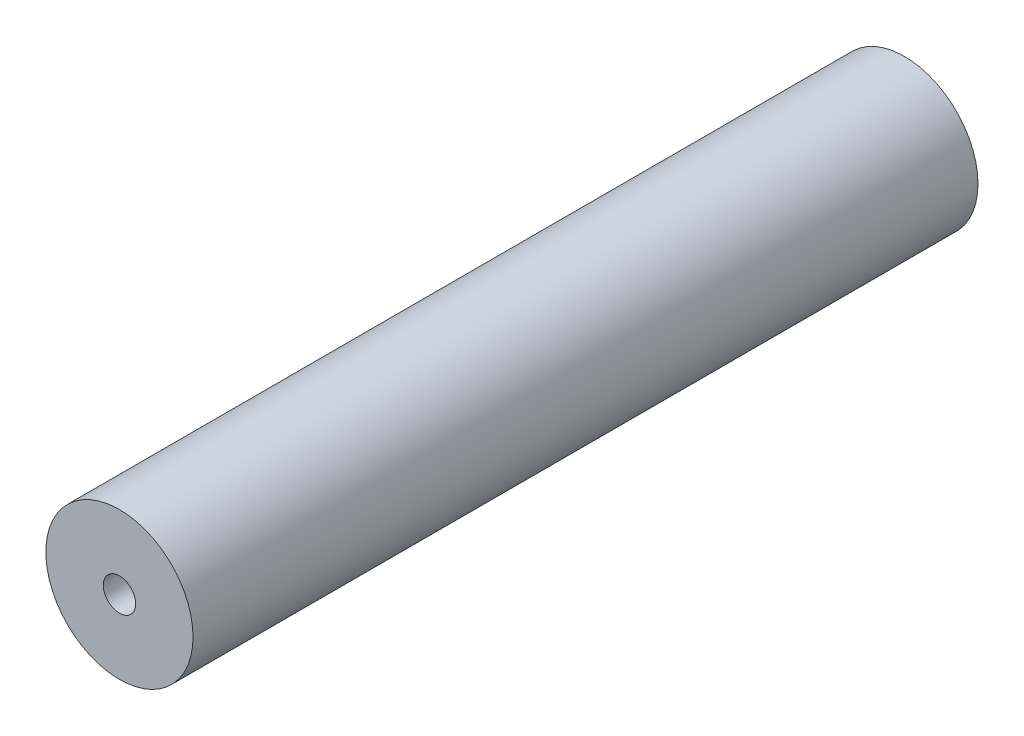
ISO-10303-21;
HEADER;
FILE_DESCRIPTION(('STEP AP214'),'2;1');
FILE_NAME('part.step','',(''),(''),'','','');
FILE_SCHEMA(('AUTOMOTIVE_DESIGN { 1 0 10303 214 1 1 1 1 }'));
ENDSEC;
DATA;
#1=APPLICATION_CONTEXT('core data for automotive mechanical design processes');
#2=APPLICATION_PROTOCOL_DEFINITION('international standard','automotive_design',2000,#1);
#3=PRODUCT_CONTEXT('',#1,'mechanical');
#4=PRODUCT('Part','Part','',(#3));
#5=PRODUCT_RELATED_PRODUCT_CATEGORY('part','',(#4));
#6=PRODUCT_DEFINITION_FORMATION('','',#4);
#7=PRODUCT_DEFINITION_CONTEXT('part definition',#1,'design');
#8=PRODUCT_DEFINITION('design','',#6,#7);
#9=PRODUCT_DEFINITION_SHAPE('','',#8);
#10=(LENGTH_UNIT() NAMED_UNIT(*) SI_UNIT(.MILLI.,.METRE.));
#11=(NAMED_UNIT(*) PLANE_ANGLE_UNIT() SI_UNIT($,.RADIAN.));
#12=(NAMED_UNIT(*) SI_UNIT($,.STERADIAN.) SOLID_ANGLE_UNIT());
#13=UNCERTAINTY_MEASURE_WITH_UNIT(LENGTH_MEASURE(1.E-05),#10,'distance_accuracy_value','');
#14=(GEOMETRIC_REPRESENTATION_CONTEXT(3) GLOBAL_UNCERTAINTY_ASSIGNED_CONTEXT((#13)) GLOBAL_UNIT_ASSIGNED_CONTEXT((#10,
#11,#12)) REPRESENTATION_CONTEXT('',''));
#15=CARTESIAN_POINT('',(0.,0.,0.));
#16=DIRECTION('',(0.,0.,1.));
#17=DIRECTION('',(1.,0.,0.));
#18=AXIS2_PLACEMENT_3D('',#15,#16,#17);
#19=CARTESIAN_POINT('',(0.,0.,80.));
#20=DIRECTION('',(0.,0.,-1.));
#21=DIRECTION('',(-1.,0.,0.));
#22=AXIS2_PLACEMENT_3D('',#19,#20,#21);
#23=CYLINDRICAL_SURFACE('',#22,7.5);
#24=CARTESIAN_POINT('',(0.,0.,80.));
#25=DIRECTION('',(0.,0.,1.));
#26=DIRECTION('',(1.,0.,0.));
#27=AXIS2_PLACEMENT_3D('',#24,#25,#26);
#28=CIRCLE('',#27,7.5);
#29=CARTESIAN_POINT('',(7.5,0.,80.));
#30=VERTEX_POINT('',#29);
#31=EDGE_CURVE('E10',#30,#30,#28,.T.);
#32=ORIENTED_EDGE('',*,*,#31,.F.);
#33=EDGE_LOOP('',(#32));
#34=FACE_BOUND('',#33,.T.);
#35=CARTESIAN_POINT('',(0.,0.,0.));
#36=DIRECTION('',(0.,0.,1.));
#37=DIRECTION('',(1.,0.,0.));
#38=AXIS2_PLACEMENT_3D('',#35,#36,#37);
#39=CIRCLE('',#38,7.5);
#40=CARTESIAN_POINT('',(7.5,0.,0.));
#41=VERTEX_POINT('',#40);
#42=EDGE_CURVE('E36',#41,#41,#39,.T.);
#43=ORIENTED_EDGE('',*,*,#42,.T.);
#44=EDGE_LOOP('',(#43));
#45=FACE_BOUND('',#44,.T.);
#46=ADVANCED_FACE('F33',(#34,#45),#23,.T.);
#47=CARTESIAN_POINT('',(0.,0.,80.));
#48=DIRECTION('',(0.,0.,1.));
#49=DIRECTION('',(1.,0.,0.));
#50=AXIS2_PLACEMENT_3D('',#47,#48,#49);
#51=PLANE('',#50);
#52=CARTESIAN_POINT('',(0.,0.,80.));
#53=DIRECTION('',(0.,0.,1.));
#54=DIRECTION('',(1.,0.,0.));
#55=AXIS2_PLACEMENT_3D('',#52,#53,#54);
#56=CIRCLE('',#55,1.65);
#57=CARTESIAN_POINT('',(1.65,0.,80.));
#58=VERTEX_POINT('',#57);
#59=EDGE_CURVE('E45',#58,#58,#56,.T.);
#60=ORIENTED_EDGE('',*,*,#59,.F.);
#61=EDGE_LOOP('',(#60));
#62=FACE_BOUND('',#61,.T.);
#63=ORIENTED_EDGE('',*,*,#31,.T.);
#64=EDGE_LOOP('',(#63));
#65=FACE_BOUND('',#64,.T.);
#66=ADVANCED_FACE('F69',(#62,#65),#51,.T.);
#67=CARTESIAN_POINT('',(0.,0.,0.));
#68=DIRECTION('',(0.,0.,1.));
#69=DIRECTION('',(1.,0.,0.));
#70=AXIS2_PLACEMENT_3D('',#67,#68,#69);
#71=PLANE('',#70);
#72=CARTESIAN_POINT('',(0.,0.,0.));
#73=DIRECTION('',(0.,0.,1.));
#74=DIRECTION('',(1.,0.,0.));
#75=AXIS2_PLACEMENT_3D('',#72,#73,#74);
#76=CIRCLE('',#75,1.65);
#77=CARTESIAN_POINT('',(1.65,0.,0.));
#78=VERTEX_POINT('',#77);
#79=EDGE_CURVE('E51',#78,#78,#76,.T.);
#80=ORIENTED_EDGE('',*,*,#79,.T.);
#81=EDGE_LOOP('',(#80));
#82=FACE_BOUND('',#81,.T.);
#83=ORIENTED_EDGE('',*,*,#42,.F.);
#84=EDGE_LOOP('',(#83));
#85=FACE_BOUND('',#84,.T.);
#86=ADVANCED_FACE('F74',(#82,#85),#71,.F.);
#87=CARTESIAN_POINT('',(0.,0.,70.));
#88=DIRECTION('',(0.,0.,1.));
#89=DIRECTION('',(1.,0.,0.));
#90=AXIS2_PLACEMENT_3D('',#87,#88,#89);
#91=CYLINDRICAL_SURFACE('',#90,1.65);
#92=CARTESIAN_POINT('',(0.,0.,70.));
#93=DIRECTION('',(0.,0.,1.));
#94=DIRECTION('',(1.,0.,0.));
#95=AXIS2_PLACEMENT_3D('',#92,#93,#94);
#96=CIRCLE('',#95,1.65);
#97=CARTESIAN_POINT('',(1.65,0.,70.));
#98=VERTEX_POINT('',#97);
#99=EDGE_CURVE('E43',#98,#98,#96,.T.);
#100=ORIENTED_EDGE('',*,*,#99,.F.);
#101=EDGE_LOOP('',(#100));
#102=FACE_BOUND('',#101,.T.);
#103=ORIENTED_EDGE('',*,*,#59,.T.);
#104=EDGE_LOOP('',(#103));
#105=FACE_BOUND('',#104,.T.);
#106=ADVANCED_FACE('F81',(#102,#105),#91,.F.);
#107=CARTESIAN_POINT('',(0.,0.,70.));
#108=DIRECTION('',(0.,0.,1.));
#109=DIRECTION('',(1.,0.,0.));
#110=AXIS2_PLACEMENT_3D('',#107,#108,#109);
#111=PLANE('',#110);
#112=ORIENTED_EDGE('',*,*,#99,.T.);
#113=EDGE_LOOP('',(#112));
#114=FACE_BOUND('',#113,.T.);
#115=ADVANCED_FACE('F66',(#114),#111,.T.);
#116=CARTESIAN_POINT('',(0.,0.,10.));
#117=DIRECTION('',(0.,0.,-1.));
#118=DIRECTION('',(-1.,0.,0.));
#119=AXIS2_PLACEMENT_3D('',#116,#117,#118);
#120=CYLINDRICAL_SURFACE('',#119,1.65);
#121=CARTESIAN_POINT('',(0.,0.,10.));
#122=DIRECTION('',(0.,0.,1.));
#123=DIRECTION('',(1.,0.,0.));
#124=AXIS2_PLACEMENT_3D('',#121,#122,#123);
#125=CIRCLE('',#124,1.65);
#126=CARTESIAN_POINT('',(1.65,0.,10.));
#127=VERTEX_POINT('',#126);
#128=EDGE_CURVE('E48',#127,#127,#125,.T.);
#129=ORIENTED_EDGE('',*,*,#128,.T.);
#130=EDGE_LOOP('',(#129));
#131=FACE_BOUND('',#130,.T.);
#132=ORIENTED_EDGE('',*,*,#79,.F.);
#133=EDGE_LOOP('',(#132));
#134=FACE_BOUND('',#133,.T.);
#135=ADVANCED_FACE('F57',(#131,#134),#120,.F.);
#136=CARTESIAN_POINT('',(0.,0.,10.));
#137=DIRECTION('',(0.,0.,-1.));
#138=DIRECTION('',(1.,0.,0.));
#139=AXIS2_PLACEMENT_3D('',#136,#137,#138);
#140=PLANE('',#139);
#141=ORIENTED_EDGE('',*,*,#128,.F.);
#142=EDGE_LOOP('',(#141));
#143=FACE_BOUND('',#142,.T.);
#144=ADVANCED_FACE('F60',(#143),#140,.T.);
#145=CLOSED_SHELL('',(#46,#66,#86,#106,#115,#135,#144));
#146=MANIFOLD_SOLID_BREP('B2',#145);
#147=ADVANCED_BREP_SHAPE_REPRESENTATION('',(#18,#146),#14);
#148=SHAPE_DEFINITION_REPRESENTATION(#9,#147);
ENDSEC;
END-ISO-10303-21;
